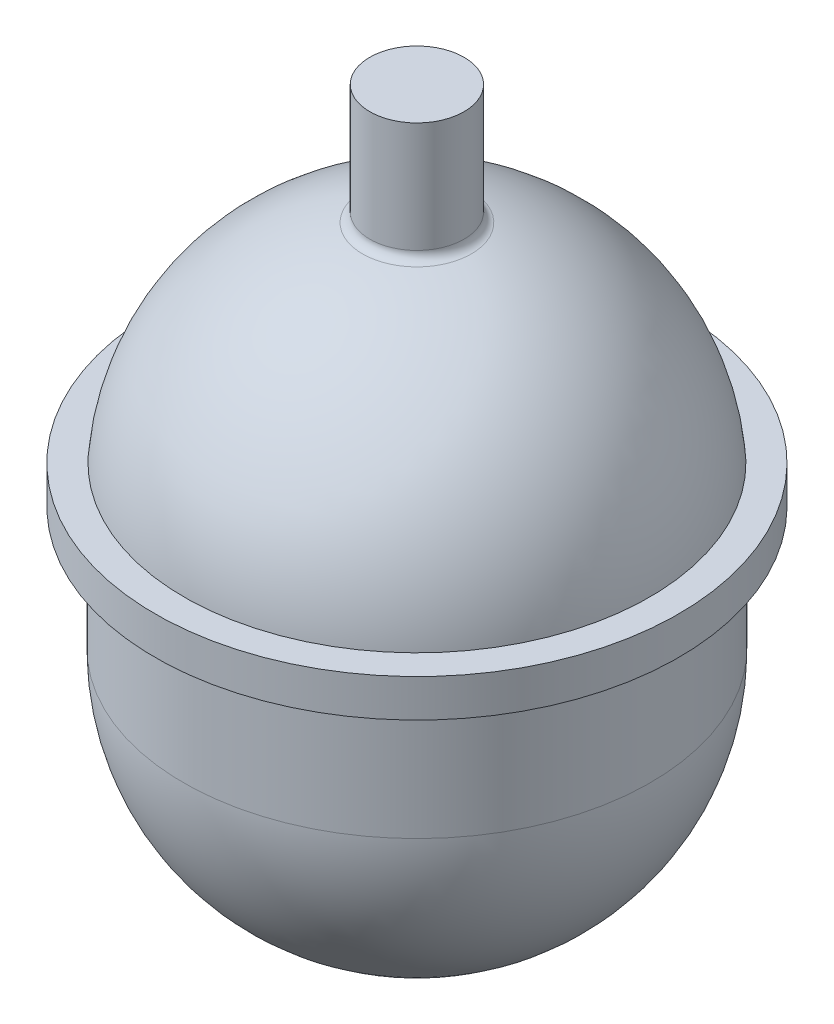
ISO-10303-21;
HEADER;
FILE_DESCRIPTION(('STEP AP214'),'2;1');
FILE_NAME('part.step','',(''),(''),'','','');
FILE_SCHEMA(('AUTOMOTIVE_DESIGN { 1 0 10303 214 1 1 1 1 }'));
ENDSEC;
DATA;
#1=APPLICATION_CONTEXT('core data for automotive mechanical design processes');
#2=APPLICATION_PROTOCOL_DEFINITION('international standard','automotive_design',2000,#1);
#3=PRODUCT_CONTEXT('',#1,'mechanical');
#4=PRODUCT('Part','Part','',(#3));
#5=PRODUCT_RELATED_PRODUCT_CATEGORY('part','',(#4));
#6=PRODUCT_DEFINITION_FORMATION('','',#4);
#7=PRODUCT_DEFINITION_CONTEXT('part definition',#1,'design');
#8=PRODUCT_DEFINITION('design','',#6,#7);
#9=PRODUCT_DEFINITION_SHAPE('','',#8);
#10=(LENGTH_UNIT() NAMED_UNIT(*) SI_UNIT(.MILLI.,.METRE.));
#11=(NAMED_UNIT(*) PLANE_ANGLE_UNIT() SI_UNIT($,.RADIAN.));
#12=(NAMED_UNIT(*) SI_UNIT($,.STERADIAN.) SOLID_ANGLE_UNIT());
#13=UNCERTAINTY_MEASURE_WITH_UNIT(LENGTH_MEASURE(1.E-05),#10,'distance_accuracy_value','');
#14=(GEOMETRIC_REPRESENTATION_CONTEXT(3) GLOBAL_UNCERTAINTY_ASSIGNED_CONTEXT((#13)) GLOBAL_UNIT_ASSIGNED_CONTEXT((#10,
#11,#12)) REPRESENTATION_CONTEXT('',''));
#15=CARTESIAN_POINT('',(0.,0.,0.));
#16=DIRECTION('',(0.,0.,1.));
#17=DIRECTION('',(1.,0.,0.));
#18=AXIS2_PLACEMENT_3D('',#15,#16,#17);
#19=CARTESIAN_POINT('',(-1.18394877235417E-13,-30.0000000000001,0.));
#20=DIRECTION('',(0.,-1.,0.));
#21=DIRECTION('',(1.,0.,0.));
#22=AXIS2_PLACEMENT_3D('',#19,#20,#21);
#23=SPHERICAL_SURFACE('',#22,49.4999999999999);
#24=CARTESIAN_POINT('',(-1.18394877235417E-13,-79.1493807317157,0.));
#25=DIRECTION('',(0.,1.,0.));
#26=DIRECTION('',(0.,0.,1.));
#27=AXIS2_PLACEMENT_3D('',#24,#25,#26);
#28=CIRCLE('',#27,5.88118811881188);
#29=CARTESIAN_POINT('',(-1.18394877235417E-13,-79.1493807317157,5.88118811881188));
#30=VERTEX_POINT('',#29);
#31=EDGE_CURVE('E50',#30,#30,#28,.T.);
#32=ORIENTED_EDGE('',*,*,#31,.T.);
#33=EDGE_LOOP('',(#32));
#34=FACE_BOUND('',#33,.T.);
#35=CARTESIAN_POINT('',(0.,-30.,0.));
#36=DIRECTION('',(0.,-1.,0.));
#37=DIRECTION('',(0.,0.,-1.));
#38=AXIS2_PLACEMENT_3D('',#35,#36,#37);
#39=CIRCLE('',#38,49.5);
#40=CARTESIAN_POINT('',(0.,-30.,-49.5));
#41=VERTEX_POINT('',#40);
#42=EDGE_CURVE('E78',#41,#41,#39,.T.);
#43=ORIENTED_EDGE('',*,*,#42,.T.);
#44=EDGE_LOOP('',(#43));
#45=FACE_BOUND('',#44,.T.);
#46=ADVANCED_FACE('F42',(#34,#45),#23,.T.);
#47=CARTESIAN_POINT('',(0.,0.,0.));
#48=DIRECTION('',(0.,-1.,0.));
#49=DIRECTION('',(-1.,0.,0.));
#50=AXIS2_PLACEMENT_3D('',#47,#48,#49);
#51=SPHERICAL_SURFACE('',#50,49.5);
#52=CARTESIAN_POINT('',(0.,48.1374832321129,0.));
#53=DIRECTION('',(0.,-1.,0.));
#54=DIRECTION('',(0.,0.,-1.));
#55=AXIS2_PLACEMENT_3D('',#52,#53,#54);
#56=CIRCLE('',#55,11.5339805825243);
#57=CARTESIAN_POINT('',(-11.5339805825243,48.1374832321129,0.));
#58=VERTEX_POINT('',#57);
#59=EDGE_CURVE('E58',#58,#58,#56,.T.);
#60=CARTESIAN_POINT('',(0.,4.,0.));
#61=DIRECTION('',(0.,-1.,0.));
#62=DIRECTION('',(0.,0.,-1.));
#63=AXIS2_PLACEMENT_3D('',#60,#61,#62);
#64=CIRCLE('',#63,49.338119137235);
#65=CARTESIAN_POINT('',(-49.338119137235,4.,0.));
#66=VERTEX_POINT('',#65);
#67=EDGE_CURVE('E66',#66,#66,#64,.T.);
#68=CARTESIAN_POINT('',(-11.5339805825243,48.1374832321129,0.));
#69=CARTESIAN_POINT('',(-12.1631436911193,47.986739815451,0.));
#70=CARTESIAN_POINT('',(-12.789347657333,47.823648352148,0.));
#71=CARTESIAN_POINT('',(-14.034883006317,47.4730496457538,0.));
#72=CARTESIAN_POINT('',(-14.6542143890874,47.2855424026627,0.));
#73=CARTESIAN_POINT('',(-15.885050272504,46.8863924501865,0.));
#74=CARTESIAN_POINT('',(-16.4965547731504,46.6747497408015,0.));
#75=CARTESIAN_POINT('',(-17.7107974563465,46.2276563284017,0.));
#76=CARTESIAN_POINT('',(-18.3135356388963,45.992205625387,0.));
#77=CARTESIAN_POINT('',(-19.5093189674103,45.4978576024313,0.));
#78=CARTESIAN_POINT('',(-20.1023641133746,45.2389602824903,0.));
#79=CARTESIAN_POINT('',(-21.2778497540773,44.6981171677134,0.));
#80=CARTESIAN_POINT('',(-21.8602902488158,44.4161713728775,0.));
#81=CARTESIAN_POINT('',(-23.0136712199485,43.829664688094,0.));
#82=CARTESIAN_POINT('',(-23.5846116963427,43.5251037981465,0.));
#83=CARTESIAN_POINT('',(-24.7141149566434,42.893835119779,0.));
#84=CARTESIAN_POINT('',(-25.2726777405499,42.5671273313591,0.));
#85=CARTESIAN_POINT('',(-26.3765669654072,41.8920670840754,0.));
#86=CARTESIAN_POINT('',(-26.9218934063581,41.5437146252117,0.));
#87=CARTESIAN_POINT('',(-27.9984716434287,40.8259005420219,0.));
#88=CARTESIAN_POINT('',(-28.5297234395484,40.4564389176959,0.));
#89=CARTESIAN_POINT('',(-29.5773357210228,39.6969744575926,0.));
#90=CARTESIAN_POINT('',(-30.0936962063776,39.3069716218154,0.));
#91=CARTESIAN_POINT('',(-31.1107320921046,38.5070242700288,0.));
#92=CARTESIAN_POINT('',(-31.6114074924769,38.0970797540194,0.));
#93=CARTESIAN_POINT('',(-32.5963035458699,37.2578792282279,0.));
#94=CARTESIAN_POINT('',(-33.0805241988907,36.8286232184459,0.));
#95=CARTESIAN_POINT('',(-34.0317663902483,35.9514595781474,0.));
#96=CARTESIAN_POINT('',(-34.4987879285851,35.5035519476309,0.));
#97=CARTESIAN_POINT('',(-35.414913962549,34.5897736110671,0.));
#98=CARTESIAN_POINT('',(-35.8640184581761,34.1239029050198,0.));
#99=CARTESIAN_POINT('',(-36.7436200216373,33.1749145763052,0.));
#100=CARTESIAN_POINT('',(-37.1741170894714,32.6917969536379,0.));
#101=CARTESIAN_POINT('',(-38.0158420164981,31.7090574633854,0.));
#102=CARTESIAN_POINT('',(-38.4270698756907,31.2094355958002,0.));
#103=CARTESIAN_POINT('',(-39.2296242261428,30.1944556585352,0.));
#104=CARTESIAN_POINT('',(-39.6209507174023,29.6790975888554,0.));
#105=CARTESIAN_POINT('',(-40.3831007660382,28.6334374806731,0.));
#106=CARTESIAN_POINT('',(-40.7539243234147,28.1031354421705,0.));
#107=CARTESIAN_POINT('',(-41.4744984564349,27.0284026022039,0.));
#108=CARTESIAN_POINT('',(-41.8242490320785,26.4839718007398,0.));
#109=CARTESIAN_POINT('',(-42.5021395481813,25.3818183601265,0.));
#110=CARTESIAN_POINT('',(-42.8302794886404,24.8240957209773,0.));
#111=CARTESIAN_POINT('',(-43.4644443018525,23.696215963126,0.));
#112=CARTESIAN_POINT('',(-43.7704691746055,23.126058844424,0.));
#113=CARTESIAN_POINT('',(-44.3599334161583,21.9741866004722,0.));
#114=CARTESIAN_POINT('',(-44.6433727849581,21.3924714752224,0.));
#115=CARTESIAN_POINT('',(-45.1872303021586,20.2183774587381,0.));
#116=CARTESIAN_POINT('',(-45.4476484505593,19.6259985675037,0.));
#117=CARTESIAN_POINT('',(-45.9450631988171,18.4314876523445,0.));
#118=CARTESIAN_POINT('',(-46.1820597986741,17.8293556284197,0.));
#119=CARTESIAN_POINT('',(-46.6322671302724,16.616264074623,0.));
#120=CARTESIAN_POINT('',(-46.8454778620136,16.0053045447511,0.));
#121=CARTESIAN_POINT('',(-47.2477856882649,14.7754971741422,0.));
#122=CARTESIAN_POINT('',(-47.4368827827748,14.1566493334053,0.));
#123=CARTESIAN_POINT('',(-47.7906726875617,12.9120166688931,0.));
#124=CARTESIAN_POINT('',(-47.9553654978385,12.2862318451178,0.));
#125=CARTESIAN_POINT('',(-48.2600935030544,11.0286871821378,0.));
#126=CARTESIAN_POINT('',(-48.4001286979934,10.3969273429331,0.));
#127=CARTESIAN_POINT('',(-48.6553267910173,9.12840389166248,0.));
#128=CARTESIAN_POINT('',(-48.7704896891022,8.49164027959655,0.));
#129=CARTESIAN_POINT('',(-48.9757639624869,7.21408788178495,0.));
#130=CARTESIAN_POINT('',(-49.0658753377867,6.57329909603928,0.));
#131=CARTESIAN_POINT('',(-49.2209162226004,5.28868238957382,0.));
#132=CARTESIAN_POINT('',(-49.2858457321143,4.64485446885403,0.));
#133=CARTESIAN_POINT('',(-49.338119137235,4.00000000000001,0.));
#134=B_SPLINE_CURVE_WITH_KNOTS('',3,(#68,#69,#70,#71,#72,#73,#74,#75,#76,#77,#78,#79,#80,#81,
#82,#83,#84,#85,#86,#87,#88,#89,#90,#91,#92,#93,#94,#95,#96,#97,#98,#99,#100,#101,#102,#103,
#104,#105,#106,#107,#108,#109,#110,#111,#112,#113,#114,#115,#116,#117,#118,#119,#120,#121,#122,
#123,#124,#125,#126,#127,#128,#129,#130,#131,#132,#133),.UNSPECIFIED.,.F.,.F.,(4,2,2,2,2,2,2,2,
2,2,2,2,2,2,2,2,2,2,2,2,2,2,2,2,2,2,2,2,2,2,2,2,4),(0.,1.94078397421817,3.88156794843635,
5.82235192265452,7.7631358968727,9.70391987109087,11.644703845309,13.5854878195272,
15.5262717937454,17.4670557679636,19.4078397421817,21.3486237163999,23.2894076906181,
25.2301916648363,27.1709756390544,29.1117596132726,31.0525435874908,32.993327561709,
34.9341115359271,36.8748955101453,38.8156794843635,40.7564634585816,42.6972474327998,
44.638031407018,46.5788153812362,48.5195993554544,50.4603833296725,52.4011673038907,
54.3419512781089,56.282735252327,58.2235192265452,60.1643032007634,62.1050871749816),.UNSPECIFIED.);
#135=EDGE_CURVE('BSEAM116',#58,#66,#134,.T.);
#136=ORIENTED_EDGE('',*,*,#59,.T.);
#137=ORIENTED_EDGE('',*,*,#67,.F.);
#138=ORIENTED_EDGE('',*,*,#135,.T.);
#139=ORIENTED_EDGE('',*,*,#135,.F.);
#140=EDGE_LOOP('',(#136,#138,#137,#139));
#141=FACE_BOUND('',#140,.T.);
#142=ADVANCED_FACE('F116',(#141),#51,.T.);
#143=CARTESIAN_POINT('',(0.,4.,0.));
#144=DIRECTION('',(0.,1.,0.));
#145=DIRECTION('',(0.,0.,1.));
#146=AXIS2_PLACEMENT_3D('',#143,#144,#145);
#147=PLANE('',#146);
#148=ORIENTED_EDGE('',*,*,#67,.T.);
#149=EDGE_LOOP('',(#148));
#150=FACE_BOUND('',#149,.T.);
#151=CARTESIAN_POINT('',(0.,4.,0.));
#152=DIRECTION('',(0.,-1.,0.));
#153=DIRECTION('',(0.,0.,-1.));
#154=AXIS2_PLACEMENT_3D('',#151,#152,#153);
#155=CIRCLE('',#154,55.5);
#156=CARTESIAN_POINT('',(0.,4.,-55.5));
#157=VERTEX_POINT('',#156);
#158=EDGE_CURVE('E69',#157,#157,#155,.T.);
#159=ORIENTED_EDGE('',*,*,#158,.F.);
#160=EDGE_LOOP('',(#159));
#161=FACE_BOUND('',#160,.T.);
#162=ADVANCED_FACE('F123',(#150,#161),#147,.T.);
#163=CARTESIAN_POINT('',(0.,-85.95,0.));
#164=DIRECTION('',(0.,-1.,0.));
#165=DIRECTION('',(0.,0.,-1.));
#166=AXIS2_PLACEMENT_3D('',#163,#164,#165);
#167=CYLINDRICAL_SURFACE('',#166,55.5);
#168=ORIENTED_EDGE('',*,*,#158,.T.);
#169=EDGE_LOOP('',(#168));
#170=FACE_BOUND('',#169,.T.);
#171=CARTESIAN_POINT('',(0.,-4.,0.));
#172=DIRECTION('',(0.,-1.,0.));
#173=DIRECTION('',(0.,0.,-1.));
#174=AXIS2_PLACEMENT_3D('',#171,#172,#173);
#175=CIRCLE('',#174,55.5);
#176=CARTESIAN_POINT('',(0.,-4.,-55.5));
#177=VERTEX_POINT('',#176);
#178=EDGE_CURVE('E72',#177,#177,#175,.T.);
#179=ORIENTED_EDGE('',*,*,#178,.F.);
#180=EDGE_LOOP('',(#179));
#181=FACE_BOUND('',#180,.T.);
#182=ADVANCED_FACE('F234',(#170,#181),#167,.T.);
#183=CARTESIAN_POINT('',(0.,-4.,0.));
#184=DIRECTION('',(0.,1.,0.));
#185=DIRECTION('',(0.,0.,1.));
#186=AXIS2_PLACEMENT_3D('',#183,#184,#185);
#187=PLANE('',#186);
#188=CARTESIAN_POINT('',(0.,-4.,0.));
#189=DIRECTION('',(0.,-1.,0.));
#190=DIRECTION('',(0.,0.,-1.));
#191=AXIS2_PLACEMENT_3D('',#188,#189,#190);
#192=CIRCLE('',#191,49.5);
#193=CARTESIAN_POINT('',(0.,-4.,-49.5));
#194=VERTEX_POINT('',#193);
#195=EDGE_CURVE('E75',#194,#194,#192,.T.);
#196=ORIENTED_EDGE('',*,*,#195,.F.);
#197=EDGE_LOOP('',(#196));
#198=FACE_BOUND('',#197,.T.);
#199=ORIENTED_EDGE('',*,*,#178,.T.);
#200=EDGE_LOOP('',(#199));
#201=FACE_BOUND('',#200,.T.);
#202=ADVANCED_FACE('F226',(#198,#201),#187,.F.);
#203=CARTESIAN_POINT('',(0.,-85.95,0.));
#204=DIRECTION('',(0.,-1.,0.));
#205=DIRECTION('',(0.,0.,-1.));
#206=AXIS2_PLACEMENT_3D('',#203,#204,#205);
#207=CYLINDRICAL_SURFACE('',#206,49.5);
#208=ORIENTED_EDGE('',*,*,#42,.F.);
#209=EDGE_LOOP('',(#208));
#210=FACE_BOUND('',#209,.T.);
#211=ORIENTED_EDGE('',*,*,#195,.T.);
#212=EDGE_LOOP('',(#211));
#213=FACE_BOUND('',#212,.T.);
#214=ADVANCED_FACE('F166',(#210,#213),#207,.T.);
#215=CARTESIAN_POINT('',(0.,73.5,0.));
#216=DIRECTION('',(0.,-1.,0.));
#217=DIRECTION('',(0.,0.,-1.));
#218=AXIS2_PLACEMENT_3D('',#215,#216,#217);
#219=CYLINDRICAL_SURFACE('',#218,10.);
#220=CARTESIAN_POINT('',(0.,50.0824320495721,0.));
#221=DIRECTION('',(0.,-1.,0.));
#222=DIRECTION('',(0.,0.,-1.));
#223=AXIS2_PLACEMENT_3D('',#220,#221,#222);
#224=CIRCLE('',#223,10.);
#225=CARTESIAN_POINT('',(0.,50.0824320495721,-10.));
#226=VERTEX_POINT('',#225);
#227=EDGE_CURVE('E54',#226,#226,#224,.F.);
#228=CARTESIAN_POINT('',(0.,73.5,0.));
#229=DIRECTION('',(0.,1.,0.));
#230=DIRECTION('',(0.,0.,1.));
#231=AXIS2_PLACEMENT_3D('',#228,#229,#230);
#232=CIRCLE('',#231,10.);
#233=CARTESIAN_POINT('',(0.,73.5,-10.));
#234=VERTEX_POINT('',#233);
#235=EDGE_CURVE('E87',#234,#234,#232,.T.);
#236=CARTESIAN_POINT('',(0.,50.0824320495721,-10.));
#237=CARTESIAN_POINT('',(0.,50.3263650490557,-10.));
#238=CARTESIAN_POINT('',(0.,50.5702980485393,-10.));
#239=CARTESIAN_POINT('',(0.,51.0581640475066,-10.));
#240=CARTESIAN_POINT('',(0.,51.3020970469902,-10.));
#241=CARTESIAN_POINT('',(0.,51.7899630459574,-10.));
#242=CARTESIAN_POINT('',(0.,52.0338960454411,-10.));
#243=CARTESIAN_POINT('',(0.,52.5217620444083,-10.));
#244=CARTESIAN_POINT('',(0.,52.7656950438919,-10.));
#245=CARTESIAN_POINT('',(0.,53.2535610428592,-10.));
#246=CARTESIAN_POINT('',(0.,53.4974940423428,-10.));
#247=CARTESIAN_POINT('',(0.,53.9853600413101,-10.));
#248=CARTESIAN_POINT('',(0.,54.2292930407937,-10.));
#249=CARTESIAN_POINT('',(0.,54.7171590397609,-10.));
#250=CARTESIAN_POINT('',(0.,54.9610920392446,-10.));
#251=CARTESIAN_POINT('',(0.,55.4489580382118,-10.));
#252=CARTESIAN_POINT('',(0.,55.6928910376954,-10.));
#253=CARTESIAN_POINT('',(0.,56.1807570366627,-10.));
#254=CARTESIAN_POINT('',(0.,56.4246900361463,-10.));
#255=CARTESIAN_POINT('',(0.,56.9125560351135,-10.));
#256=CARTESIAN_POINT('',(0.,57.1564890345972,-10.));
#257=CARTESIAN_POINT('',(0.,57.6443550335644,-10.));
#258=CARTESIAN_POINT('',(0.,57.888288033048,-10.));
#259=CARTESIAN_POINT('',(0.,58.3761540320153,-10.));
#260=CARTESIAN_POINT('',(0.,58.6200870314989,-10.));
#261=CARTESIAN_POINT('',(0.,59.1079530304662,-10.));
#262=CARTESIAN_POINT('',(0.,59.3518860299498,-10.));
#263=CARTESIAN_POINT('',(0.,59.839752028917,-10.));
#264=CARTESIAN_POINT('',(0.,60.0836850284007,-10.));
#265=CARTESIAN_POINT('',(0.,60.5715510273679,-10.));
#266=CARTESIAN_POINT('',(0.,60.8154840268515,-10.));
#267=CARTESIAN_POINT('',(0.,61.3033500258188,-10.));
#268=CARTESIAN_POINT('',(0.,61.5472830253024,-10.));
#269=CARTESIAN_POINT('',(0.,62.0351490242697,-10.));
#270=CARTESIAN_POINT('',(0.,62.2790820237533,-10.));
#271=CARTESIAN_POINT('',(0.,62.7669480227205,-10.));
#272=CARTESIAN_POINT('',(0.,63.0108810222041,-10.));
#273=CARTESIAN_POINT('',(0.,63.4987470211714,-10.));
#274=CARTESIAN_POINT('',(0.,63.742680020655,-10.));
#275=CARTESIAN_POINT('',(0.,64.2305460196223,-10.));
#276=CARTESIAN_POINT('',(0.,64.4744790191059,-10.));
#277=CARTESIAN_POINT('',(0.,64.9623450180732,-10.));
#278=CARTESIAN_POINT('',(0.,65.2062780175568,-10.));
#279=CARTESIAN_POINT('',(0.,65.694144016524,-10.));
#280=CARTESIAN_POINT('',(0.,65.9380770160076,-10.));
#281=CARTESIAN_POINT('',(0.,66.4259430149749,-10.));
#282=CARTESIAN_POINT('',(0.,66.6698760144585,-10.));
#283=CARTESIAN_POINT('',(0.,67.1577420134258,-10.));
#284=CARTESIAN_POINT('',(0.,67.4016750129094,-10.));
#285=CARTESIAN_POINT('',(0.,67.8895410118766,-10.));
#286=CARTESIAN_POINT('',(0.,68.1334740113603,-10.));
#287=CARTESIAN_POINT('',(0.,68.6213400103275,-10.));
#288=CARTESIAN_POINT('',(0.,68.8652730098111,-10.));
#289=CARTESIAN_POINT('',(0.,69.3531390087784,-10.));
#290=CARTESIAN_POINT('',(0.,69.597072008262,-10.));
#291=CARTESIAN_POINT('',(0.,70.0849380072292,-10.));
#292=CARTESIAN_POINT('',(0.,70.3288710067129,-10.));
#293=CARTESIAN_POINT('',(0.,70.8167370056801,-10.));
#294=CARTESIAN_POINT('',(0.,71.0606700051638,-10.));
#295=CARTESIAN_POINT('',(0.,71.548536004131,-10.));
#296=CARTESIAN_POINT('',(0.,71.7924690036146,-10.));
#297=CARTESIAN_POINT('',(0.,72.2803350025819,-10.));
#298=CARTESIAN_POINT('',(0.,72.5242680020655,-10.));
#299=CARTESIAN_POINT('',(0.,73.0121340010327,-10.));
#300=CARTESIAN_POINT('',(0.,73.2560670005164,-10.));
#301=CARTESIAN_POINT('',(0.,73.5,-10.));
#302=B_SPLINE_CURVE_WITH_KNOTS('',3,(#236,#237,#238,#239,#240,#241,#242,#243,#244,#245,#246,
#247,#248,#249,#250,#251,#252,#253,#254,#255,#256,#257,#258,#259,#260,#261,#262,#263,#264,#265,
#266,#267,#268,#269,#270,#271,#272,#273,#274,#275,#276,#277,#278,#279,#280,#281,#282,#283,#284,
#285,#286,#287,#288,#289,#290,#291,#292,#293,#294,#295,#296,#297,#298,#299,#300,#301),
.UNSPECIFIED.,.F.,.F.,(4,2,2,2,2,2,2,2,2,2,2,2,2,2,2,2,2,2,2,2,2,2,2,2,2,2,2,2,2,2,2,2,4),(0.,
0.731798998450876,1.46359799690175,2.19539699535262,2.92719599380349,3.65899499225437,
4.39079399070524,5.12259298915611,5.85439198760698,6.58619098605785,7.31798998450874,
8.0497889829596,8.78158798141047,9.51338697986134,10.2451859783122,10.9769849767631,
11.708783975214,12.4405829736648,13.1723819721157,13.9041809705666,14.6359799690175,
15.3677789674683,16.0995779659192,16.8313769643701,17.5631759628209,18.2949749612718,
19.0267739597227,19.7585729581736,20.4903719566244,21.2221709550753,21.9539699535262,
22.685768951977,23.4175679504279),.UNSPECIFIED.);
#303=EDGE_CURVE('BSEAM111',#226,#234,#302,.T.);
#304=ORIENTED_EDGE('',*,*,#227,.T.);
#305=ORIENTED_EDGE('',*,*,#235,.F.);
#306=ORIENTED_EDGE('',*,*,#303,.T.);
#307=ORIENTED_EDGE('',*,*,#303,.F.);
#308=EDGE_LOOP('',(#304,#306,#305,#307));
#309=FACE_BOUND('',#308,.T.);
#310=ADVANCED_FACE('F111',(#309),#219,.T.);
#311=CARTESIAN_POINT('',(0.,73.5,0.));
#312=DIRECTION('',(0.,1.,0.));
#313=DIRECTION('',(0.,0.,1.));
#314=AXIS2_PLACEMENT_3D('',#311,#312,#313);
#315=PLANE('',#314);
#316=ORIENTED_EDGE('',*,*,#235,.T.);
#317=EDGE_LOOP('',(#316));
#318=FACE_BOUND('',#317,.T.);
#319=ADVANCED_FACE('F102',(#318),#315,.T.);
#320=CARTESIAN_POINT('',(0.,-82.5,0.));
#321=DIRECTION('',(0.,-1.,0.));
#322=DIRECTION('',(0.,0.,-1.));
#323=AXIS2_PLACEMENT_3D('',#320,#321,#322);
#324=PLANE('',#323);
#325=CARTESIAN_POINT('',(0.,-82.5,0.));
#326=DIRECTION('',(0.,-1.,0.));
#327=DIRECTION('',(0.,0.,-1.));
#328=AXIS2_PLACEMENT_3D('',#325,#326,#327);
#329=CIRCLE('',#328,5.);
#330=CARTESIAN_POINT('',(0.,-82.5,-5.));
#331=VERTEX_POINT('',#330);
#332=EDGE_CURVE('E90',#331,#331,#329,.T.);
#333=ORIENTED_EDGE('',*,*,#332,.T.);
#334=EDGE_LOOP('',(#333));
#335=FACE_BOUND('',#334,.T.);
#336=CARTESIAN_POINT('',(0.,-82.5,0.));
#337=DIRECTION('',(0.,-1.,0.));
#338=DIRECTION('',(0.,0.,-1.));
#339=AXIS2_PLACEMENT_3D('',#336,#337,#338);
#340=CIRCLE('',#339,2.);
#341=CARTESIAN_POINT('',(0.,-82.5,-2.));
#342=VERTEX_POINT('',#341);
#343=EDGE_CURVE('E93',#342,#342,#340,.T.);
#344=ORIENTED_EDGE('',*,*,#343,.F.);
#345=EDGE_LOOP('',(#344));
#346=FACE_BOUND('',#345,.T.);
#347=ADVANCED_FACE('F99',(#335,#346),#324,.T.);
#348=CARTESIAN_POINT('',(0.,-82.5,0.));
#349=DIRECTION('',(0.,1.,0.));
#350=DIRECTION('',(0.,0.,1.));
#351=AXIS2_PLACEMENT_3D('',#348,#349,#350);
#352=CYLINDRICAL_SURFACE('',#351,5.);
#353=CARTESIAN_POINT('',(0.,-80.1422975141746,0.));
#354=DIRECTION('',(0.,1.,0.));
#355=DIRECTION('',(0.,0.,1.));
#356=AXIS2_PLACEMENT_3D('',#353,#354,#355);
#357=CIRCLE('',#356,5.);
#358=CARTESIAN_POINT('',(0.,-80.1422975141746,5.));
#359=VERTEX_POINT('',#358);
#360=EDGE_CURVE('E10',#359,#359,#357,.F.);
#361=ORIENTED_EDGE('',*,*,#360,.T.);
#362=EDGE_LOOP('',(#361));
#363=FACE_BOUND('',#362,.T.);
#364=ORIENTED_EDGE('',*,*,#332,.F.);
#365=EDGE_LOOP('',(#364));
#366=FACE_BOUND('',#365,.T.);
#367=ADVANCED_FACE('F101',(#363,#366),#352,.T.);
#368=CARTESIAN_POINT('',(0.,-82.5,0.));
#369=DIRECTION('',(0.,1.,0.));
#370=DIRECTION('',(0.,0.,1.));
#371=AXIS2_PLACEMENT_3D('',#368,#369,#370);
#372=CYLINDRICAL_SURFACE('',#371,2.);
#373=CARTESIAN_POINT('',(0.,-79.4595794563601,0.));
#374=DIRECTION('',(0.,1.,0.));
#375=DIRECTION('',(0.,0.,1.));
#376=AXIS2_PLACEMENT_3D('',#373,#374,#375);
#377=CIRCLE('',#376,2.);
#378=CARTESIAN_POINT('',(0.,-79.4595794563601,2.));
#379=VERTEX_POINT('',#378);
#380=EDGE_CURVE('E63',#379,#379,#377,.T.);
#381=ORIENTED_EDGE('',*,*,#380,.T.);
#382=EDGE_LOOP('',(#381));
#383=FACE_BOUND('',#382,.T.);
#384=ORIENTED_EDGE('',*,*,#343,.T.);
#385=EDGE_LOOP('',(#384));
#386=FACE_BOUND('',#385,.T.);
#387=ADVANCED_FACE('F97',(#383,#386),#372,.F.);
#388=ORIENTED_EDGE('',*,*,#380,.F.);
#389=EDGE_LOOP('',(#388));
#390=FACE_BOUND('',#389,.T.);
#391=ADVANCED_FACE('F118',(#390),#23,.T.);
#392=CARTESIAN_POINT('',(0.,50.0824320495721,0.));
#393=DIRECTION('',(0.,-1.,0.));
#394=DIRECTION('',(0.,0.,-1.));
#395=AXIS2_PLACEMENT_3D('',#392,#393,#394);
#396=TOROIDAL_SURFACE('',#395,12.,2.);
#397=ORIENTED_EDGE('',*,*,#227,.F.);
#398=EDGE_LOOP('',(#397));
#399=FACE_BOUND('',#398,.T.);
#400=ORIENTED_EDGE('',*,*,#59,.F.);
#401=EDGE_LOOP('',(#400));
#402=FACE_BOUND('',#401,.T.);
#403=ADVANCED_FACE('F130',(#399,#402),#396,.F.);
#404=CARTESIAN_POINT('',(0.,-80.1422975141746,0.));
#405=DIRECTION('',(0.,1.,0.));
#406=DIRECTION('',(0.,0.,1.));
#407=AXIS2_PLACEMENT_3D('',#404,#405,#406);
#408=TOROIDAL_SURFACE('',#407,6.,1.);
#409=ORIENTED_EDGE('',*,*,#360,.F.);
#410=EDGE_LOOP('',(#409));
#411=FACE_BOUND('',#410,.T.);
#412=ORIENTED_EDGE('',*,*,#31,.F.);
#413=EDGE_LOOP('',(#412));
#414=FACE_BOUND('',#413,.T.);
#415=ADVANCED_FACE('F44',(#411,#414),#408,.F.);
#416=CLOSED_SHELL('',(#46,#142,#162,#182,#202,#214,#310,#319,#347,#367,#387,#391,#403,#415));
#417=CARTESIAN_POINT('',(-1.18394877235417E-13,-30.0000000000001,0.));
#418=DIRECTION('',(0.,-1.,0.));
#419=DIRECTION('',(1.,0.,0.));
#420=AXIS2_PLACEMENT_3D('',#417,#418,#419);
#421=SPHERICAL_SURFACE('',#420,45.4999999999999);
#422=CARTESIAN_POINT('',(0.,-30.,0.));
#423=DIRECTION('',(0.,-1.,0.));
#424=DIRECTION('',(0.,0.,-1.));
#425=AXIS2_PLACEMENT_3D('',#422,#423,#424);
#426=CIRCLE('',#425,45.5);
#427=CARTESIAN_POINT('',(0.,-30.,-45.5));
#428=VERTEX_POINT('',#427);
#429=EDGE_CURVE('E81',#428,#428,#426,.T.);
#430=ORIENTED_EDGE('',*,*,#429,.F.);
#431=EDGE_LOOP('',(#430));
#432=FACE_BOUND('',#431,.T.);
#433=ADVANCED_FACE('F211',(#432),#421,.F.);
#434=CARTESIAN_POINT('',(0.,-85.95,0.));
#435=DIRECTION('',(0.,-1.,0.));
#436=DIRECTION('',(0.,0.,-1.));
#437=AXIS2_PLACEMENT_3D('',#434,#435,#436);
#438=CYLINDRICAL_SURFACE('',#437,45.5);
#439=ORIENTED_EDGE('',*,*,#429,.T.);
#440=EDGE_LOOP('',(#439));
#441=FACE_BOUND('',#440,.T.);
#442=CARTESIAN_POINT('',(0.,0.,0.));
#443=DIRECTION('',(0.,-1.,0.));
#444=DIRECTION('',(0.,0.,-1.));
#445=AXIS2_PLACEMENT_3D('',#442,#443,#444);
#446=CIRCLE('',#445,45.5);
#447=CARTESIAN_POINT('',(0.,0.,-45.5));
#448=VERTEX_POINT('',#447);
#449=EDGE_CURVE('E84',#448,#448,#446,.T.);
#450=ORIENTED_EDGE('',*,*,#449,.F.);
#451=EDGE_LOOP('',(#450));
#452=FACE_BOUND('',#451,.T.);
#453=ADVANCED_FACE('F202',(#441,#452),#438,.F.);
#454=CARTESIAN_POINT('',(0.,0.,0.));
#455=DIRECTION('',(0.,-1.,0.));
#456=DIRECTION('',(-1.,0.,0.));
#457=AXIS2_PLACEMENT_3D('',#454,#455,#456);
#458=SPHERICAL_SURFACE('',#457,45.5);
#459=ORIENTED_EDGE('',*,*,#449,.T.);
#460=EDGE_LOOP('',(#459));
#461=FACE_BOUND('',#460,.T.);
#462=ADVANCED_FACE('F181',(#461),#458,.F.);
#463=CLOSED_SHELL('',(#433,#453,#462));
#464=ORIENTED_CLOSED_SHELL('',*,#463,.T.);
#465=BREP_WITH_VOIDS('B2',#416,(#464));
#466=ADVANCED_BREP_SHAPE_REPRESENTATION('',(#18,#465),#14);
#467=SHAPE_DEFINITION_REPRESENTATION(#9,#466);
ENDSEC;
END-ISO-10303-21;
